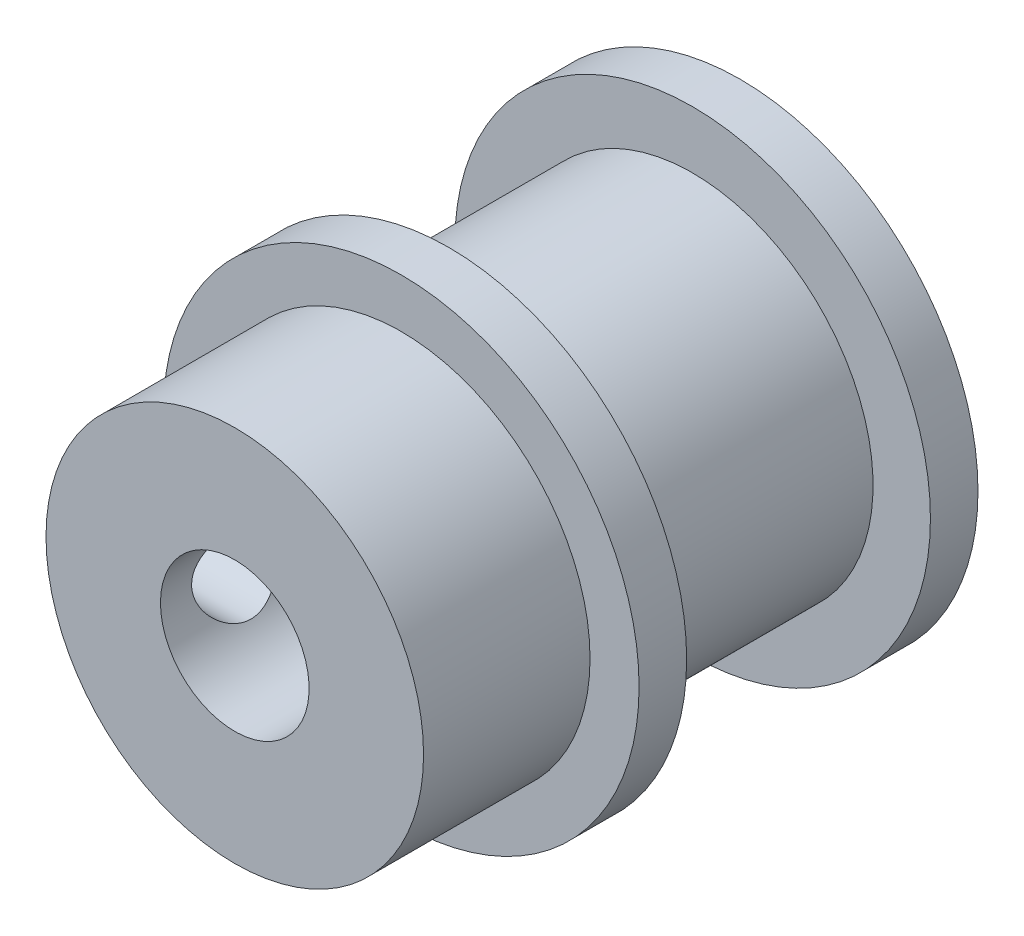
ISO-10303-21;
HEADER;
FILE_DESCRIPTION(('STEP AP214'),'2;1');
FILE_NAME('part.step','',(''),(''),'','','');
FILE_SCHEMA(('AUTOMOTIVE_DESIGN { 1 0 10303 214 1 1 1 1 }'));
ENDSEC;
DATA;
#1=APPLICATION_CONTEXT('core data for automotive mechanical design processes');
#2=APPLICATION_PROTOCOL_DEFINITION('international standard','automotive_design',2000,#1);
#3=PRODUCT_CONTEXT('',#1,'mechanical');
#4=PRODUCT('Part','Part','',(#3));
#5=PRODUCT_RELATED_PRODUCT_CATEGORY('part','',(#4));
#6=PRODUCT_DEFINITION_FORMATION('','',#4);
#7=PRODUCT_DEFINITION_CONTEXT('part definition',#1,'design');
#8=PRODUCT_DEFINITION('design','',#6,#7);
#9=PRODUCT_DEFINITION_SHAPE('','',#8);
#10=(LENGTH_UNIT() NAMED_UNIT(*) SI_UNIT(.MILLI.,.METRE.));
#11=(NAMED_UNIT(*) PLANE_ANGLE_UNIT() SI_UNIT($,.RADIAN.));
#12=(NAMED_UNIT(*) SI_UNIT($,.STERADIAN.) SOLID_ANGLE_UNIT());
#13=UNCERTAINTY_MEASURE_WITH_UNIT(LENGTH_MEASURE(1.E-05),#10,'distance_accuracy_value','');
#14=(GEOMETRIC_REPRESENTATION_CONTEXT(3) GLOBAL_UNCERTAINTY_ASSIGNED_CONTEXT((#13)) GLOBAL_UNIT_ASSIGNED_CONTEXT((#10,
#11,#12)) REPRESENTATION_CONTEXT('',''));
#15=CARTESIAN_POINT('',(0.,0.,0.));
#16=DIRECTION('',(0.,0.,1.));
#17=DIRECTION('',(1.,0.,0.));
#18=AXIS2_PLACEMENT_3D('',#15,#16,#17);
#19=CARTESIAN_POINT('',(0.,0.,0.));
#20=DIRECTION('',(0.,0.,1.));
#21=DIRECTION('',(1.,0.,0.));
#22=AXIS2_PLACEMENT_3D('',#19,#20,#21);
#23=CYLINDRICAL_SURFACE('',#22,8.);
#24=CARTESIAN_POINT('',(0.,0.,0.));
#25=DIRECTION('',(0.,0.,1.));
#26=DIRECTION('',(-1.,0.,0.));
#27=AXIS2_PLACEMENT_3D('',#24,#25,#26);
#28=CIRCLE('',#27,8.);
#29=CARTESIAN_POINT('',(-8.,0.,0.));
#30=VERTEX_POINT('',#29);
#31=EDGE_CURVE('E36',#30,#30,#28,.T.);
#32=ORIENTED_EDGE('',*,*,#31,.T.);
#33=EDGE_LOOP('',(#32));
#34=FACE_BOUND('',#33,.T.);
#35=CARTESIAN_POINT('',(0.,0.,1.6));
#36=DIRECTION('',(0.,0.,1.));
#37=DIRECTION('',(-1.,0.,0.));
#38=AXIS2_PLACEMENT_3D('',#35,#36,#37);
#39=CIRCLE('',#38,8.);
#40=CARTESIAN_POINT('',(-8.,0.,1.6));
#41=VERTEX_POINT('',#40);
#42=EDGE_CURVE('E40',#41,#41,#39,.T.);
#43=ORIENTED_EDGE('',*,*,#42,.F.);
#44=EDGE_LOOP('',(#43));
#45=FACE_BOUND('',#44,.T.);
#46=ADVANCED_FACE('F30',(#34,#45),#23,.T.);
#47=CARTESIAN_POINT('',(0.,0.,0.));
#48=DIRECTION('',(0.,0.,-1.));
#49=DIRECTION('',(-1.,0.,0.));
#50=AXIS2_PLACEMENT_3D('',#47,#48,#49);
#51=PLANE('',#50);
#52=CARTESIAN_POINT('',(0.,0.,0.));
#53=DIRECTION('',(0.,0.,-1.));
#54=DIRECTION('',(-1.,0.,0.));
#55=AXIS2_PLACEMENT_3D('',#52,#53,#54);
#56=CIRCLE('',#55,2.49999999999999);
#57=CARTESIAN_POINT('',(-2.49999999999999,0.,0.));
#58=VERTEX_POINT('',#57);
#59=EDGE_CURVE('E64',#58,#58,#56,.T.);
#60=ORIENTED_EDGE('',*,*,#59,.F.);
#61=EDGE_LOOP('',(#60));
#62=FACE_BOUND('',#61,.T.);
#63=ORIENTED_EDGE('',*,*,#31,.F.);
#64=EDGE_LOOP('',(#63));
#65=FACE_BOUND('',#64,.T.);
#66=ADVANCED_FACE('F102',(#62,#65),#51,.T.);
#67=CARTESIAN_POINT('',(0.,0.,1.6));
#68=DIRECTION('',(0.,0.,-1.));
#69=DIRECTION('',(-1.,0.,0.));
#70=AXIS2_PLACEMENT_3D('',#67,#68,#69);
#71=PLANE('',#70);
#72=CARTESIAN_POINT('',(0.,0.,1.6));
#73=DIRECTION('',(0.,0.,-1.));
#74=DIRECTION('',(-1.,0.,0.));
#75=AXIS2_PLACEMENT_3D('',#72,#73,#74);
#76=CIRCLE('',#75,6.07);
#77=CARTESIAN_POINT('',(-6.07,0.,1.6));
#78=VERTEX_POINT('',#77);
#79=EDGE_CURVE('E45',#78,#78,#76,.F.);
#80=ORIENTED_EDGE('',*,*,#79,.F.);
#81=EDGE_LOOP('',(#80));
#82=FACE_BOUND('',#81,.T.);
#83=ORIENTED_EDGE('',*,*,#42,.T.);
#84=EDGE_LOOP('',(#83));
#85=FACE_BOUND('',#84,.T.);
#86=ADVANCED_FACE('F106',(#82,#85),#71,.F.);
#87=CARTESIAN_POINT('',(0.,0.,-15.5685526472094));
#88=DIRECTION('',(0.,0.,1.));
#89=DIRECTION('',(1.,0.,0.));
#90=AXIS2_PLACEMENT_3D('',#87,#88,#89);
#91=CYLINDRICAL_SURFACE('',#90,6.07);
#92=CARTESIAN_POINT('',(0.,0.,9.8));
#93=DIRECTION('',(0.,0.,1.));
#94=DIRECTION('',(-1.,0.,0.));
#95=AXIS2_PLACEMENT_3D('',#92,#93,#94);
#96=CIRCLE('',#95,6.07);
#97=CARTESIAN_POINT('',(-6.07,0.,9.8));
#98=VERTEX_POINT('',#97);
#99=EDGE_CURVE('E49',#98,#98,#96,.T.);
#100=ORIENTED_EDGE('',*,*,#99,.F.);
#101=EDGE_LOOP('',(#100));
#102=FACE_BOUND('',#101,.T.);
#103=ORIENTED_EDGE('',*,*,#79,.T.);
#104=EDGE_LOOP('',(#103));
#105=FACE_BOUND('',#104,.T.);
#106=ADVANCED_FACE('F113',(#102,#105),#91,.T.);
#107=CARTESIAN_POINT('',(0.,0.,11.4));
#108=DIRECTION('',(0.,0.,-1.));
#109=DIRECTION('',(-1.,0.,0.));
#110=AXIS2_PLACEMENT_3D('',#107,#108,#109);
#111=CYLINDRICAL_SURFACE('',#110,8.);
#112=CARTESIAN_POINT('',(0.,0.,11.4));
#113=DIRECTION('',(0.,0.,-1.));
#114=DIRECTION('',(1.,0.,0.));
#115=AXIS2_PLACEMENT_3D('',#112,#113,#114);
#116=CIRCLE('',#115,8.);
#117=CARTESIAN_POINT('',(-8.,0.,11.4));
#118=VERTEX_POINT('',#117);
#119=EDGE_CURVE('E52',#118,#118,#116,.T.);
#120=CARTESIAN_POINT('',(0.,0.,9.8));
#121=DIRECTION('',(0.,0.,-1.));
#122=DIRECTION('',(1.,0.,0.));
#123=AXIS2_PLACEMENT_3D('',#120,#121,#122);
#124=CIRCLE('',#123,8.);
#125=CARTESIAN_POINT('',(-8.,0.,9.8));
#126=VERTEX_POINT('',#125);
#127=EDGE_CURVE('E53',#126,#126,#124,.T.);
#128=CARTESIAN_POINT('',(-8.,0.,11.4));
#129=CARTESIAN_POINT('',(-8.,0.,11.3833333333333));
#130=CARTESIAN_POINT('',(-8.,0.,11.3666666666667));
#131=CARTESIAN_POINT('',(-8.,0.,11.3333333333333));
#132=CARTESIAN_POINT('',(-8.,0.,11.3166666666667));
#133=CARTESIAN_POINT('',(-8.,0.,11.2833333333333));
#134=CARTESIAN_POINT('',(-8.,0.,11.2666666666667));
#135=CARTESIAN_POINT('',(-8.,0.,11.2333333333333));
#136=CARTESIAN_POINT('',(-8.,0.,11.2166666666667));
#137=CARTESIAN_POINT('',(-8.,0.,11.1833333333333));
#138=CARTESIAN_POINT('',(-8.,0.,11.1666666666667));
#139=CARTESIAN_POINT('',(-8.,0.,11.1333333333333));
#140=CARTESIAN_POINT('',(-8.,0.,11.1166666666667));
#141=CARTESIAN_POINT('',(-8.,0.,11.0833333333333));
#142=CARTESIAN_POINT('',(-8.,0.,11.0666666666667));
#143=CARTESIAN_POINT('',(-8.,0.,11.0333333333333));
#144=CARTESIAN_POINT('',(-8.,0.,11.0166666666667));
#145=CARTESIAN_POINT('',(-8.,0.,10.9833333333333));
#146=CARTESIAN_POINT('',(-8.,0.,10.9666666666667));
#147=CARTESIAN_POINT('',(-8.,0.,10.9333333333333));
#148=CARTESIAN_POINT('',(-8.,0.,10.9166666666667));
#149=CARTESIAN_POINT('',(-8.,0.,10.8833333333333));
#150=CARTESIAN_POINT('',(-8.,0.,10.8666666666667));
#151=CARTESIAN_POINT('',(-8.,0.,10.8333333333333));
#152=CARTESIAN_POINT('',(-8.,0.,10.8166666666667));
#153=CARTESIAN_POINT('',(-8.,0.,10.7833333333333));
#154=CARTESIAN_POINT('',(-8.,0.,10.7666666666667));
#155=CARTESIAN_POINT('',(-8.,0.,10.7333333333333));
#156=CARTESIAN_POINT('',(-8.,0.,10.7166666666667));
#157=CARTESIAN_POINT('',(-8.,0.,10.6833333333333));
#158=CARTESIAN_POINT('',(-8.,0.,10.6666666666667));
#159=CARTESIAN_POINT('',(-8.,0.,10.6333333333333));
#160=CARTESIAN_POINT('',(-8.,0.,10.6166666666667));
#161=CARTESIAN_POINT('',(-8.,0.,10.5833333333333));
#162=CARTESIAN_POINT('',(-8.,0.,10.5666666666667));
#163=CARTESIAN_POINT('',(-8.,0.,10.5333333333333));
#164=CARTESIAN_POINT('',(-8.,0.,10.5166666666667));
#165=CARTESIAN_POINT('',(-8.,0.,10.4833333333333));
#166=CARTESIAN_POINT('',(-8.,0.,10.4666666666667));
#167=CARTESIAN_POINT('',(-8.,0.,10.4333333333333));
#168=CARTESIAN_POINT('',(-8.,0.,10.4166666666667));
#169=CARTESIAN_POINT('',(-8.,0.,10.3833333333333));
#170=CARTESIAN_POINT('',(-8.,0.,10.3666666666667));
#171=CARTESIAN_POINT('',(-8.,0.,10.3333333333333));
#172=CARTESIAN_POINT('',(-8.,0.,10.3166666666667));
#173=CARTESIAN_POINT('',(-8.,0.,10.2833333333333));
#174=CARTESIAN_POINT('',(-8.,0.,10.2666666666667));
#175=CARTESIAN_POINT('',(-8.,0.,10.2333333333333));
#176=CARTESIAN_POINT('',(-8.,0.,10.2166666666667));
#177=CARTESIAN_POINT('',(-8.,0.,10.1833333333333));
#178=CARTESIAN_POINT('',(-8.,0.,10.1666666666667));
#179=CARTESIAN_POINT('',(-8.,0.,10.1333333333333));
#180=CARTESIAN_POINT('',(-8.,0.,10.1166666666667));
#181=CARTESIAN_POINT('',(-8.,0.,10.0833333333333));
#182=CARTESIAN_POINT('',(-8.,0.,10.0666666666667));
#183=CARTESIAN_POINT('',(-8.,0.,10.0333333333333));
#184=CARTESIAN_POINT('',(-8.,0.,10.0166666666667));
#185=CARTESIAN_POINT('',(-8.,0.,9.98333333333333));
#186=CARTESIAN_POINT('',(-8.,0.,9.96666666666667));
#187=CARTESIAN_POINT('',(-8.,0.,9.93333333333333));
#188=CARTESIAN_POINT('',(-8.,0.,9.91666666666667));
#189=CARTESIAN_POINT('',(-8.,0.,9.88333333333333));
#190=CARTESIAN_POINT('',(-8.,0.,9.86666666666667));
#191=CARTESIAN_POINT('',(-8.,0.,9.83333333333333));
#192=CARTESIAN_POINT('',(-8.,0.,9.81666666666667));
#193=CARTESIAN_POINT('',(-8.,0.,9.8));
#194=B_SPLINE_CURVE_WITH_KNOTS('',3,(#128,#129,#130,#131,#132,#133,#134,#135,#136,#137,#138,
#139,#140,#141,#142,#143,#144,#145,#146,#147,#148,#149,#150,#151,#152,#153,#154,#155,#156,#157,
#158,#159,#160,#161,#162,#163,#164,#165,#166,#167,#168,#169,#170,#171,#172,#173,#174,#175,#176,
#177,#178,#179,#180,#181,#182,#183,#184,#185,#186,#187,#188,#189,#190,#191,#192,#193),
.UNSPECIFIED.,.F.,.F.,(4,2,2,2,2,2,2,2,2,2,2,2,2,2,2,2,2,2,2,2,2,2,2,2,2,2,2,2,2,2,2,2,4),(0.,
0.0499999999999997,0.0999999999999994,0.149999999999999,0.199999999999999,0.249999999999999,
0.299999999999998,0.35,0.399999999999999,0.449999999999999,0.499999999999999,0.549999999999998,
0.599999999999998,0.649999999999998,0.699999999999999,0.749999999999999,0.799999999999999,
0.849999999999998,0.899999999999998,0.949999999999998,0.999999999999999,1.05,1.1,1.15,1.2,1.25,
1.3,1.35,1.4,1.45,1.5,1.55,1.6),.UNSPECIFIED.);
#195=EDGE_CURVE('BSEAM118',#118,#126,#194,.T.);
#196=ORIENTED_EDGE('',*,*,#119,.T.);
#197=ORIENTED_EDGE('',*,*,#127,.F.);
#198=ORIENTED_EDGE('',*,*,#195,.T.);
#199=ORIENTED_EDGE('',*,*,#195,.F.);
#200=EDGE_LOOP('',(#196,#198,#197,#199));
#201=FACE_BOUND('',#200,.T.);
#202=ADVANCED_FACE('F118',(#201),#111,.T.);
#203=CARTESIAN_POINT('',(0.,0.,11.4));
#204=DIRECTION('',(0.,0.,1.));
#205=DIRECTION('',(1.,0.,0.));
#206=AXIS2_PLACEMENT_3D('',#203,#204,#205);
#207=PLANE('',#206);
#208=CARTESIAN_POINT('',(0.,0.,11.4));
#209=DIRECTION('',(0.,0.,1.));
#210=DIRECTION('',(1.,0.,0.));
#211=AXIS2_PLACEMENT_3D('',#208,#209,#210);
#212=CIRCLE('',#211,6.35);
#213=CARTESIAN_POINT('',(6.35,0.,11.4));
#214=VERTEX_POINT('',#213);
#215=EDGE_CURVE('E10',#214,#214,#212,.T.);
#216=ORIENTED_EDGE('',*,*,#215,.F.);
#217=EDGE_LOOP('',(#216));
#218=FACE_BOUND('',#217,.T.);
#219=ORIENTED_EDGE('',*,*,#119,.F.);
#220=EDGE_LOOP('',(#219));
#221=FACE_BOUND('',#220,.T.);
#222=ADVANCED_FACE('F125',(#218,#221),#207,.T.);
#223=CARTESIAN_POINT('',(0.,0.,9.8));
#224=DIRECTION('',(0.,0.,1.));
#225=DIRECTION('',(1.,0.,0.));
#226=AXIS2_PLACEMENT_3D('',#223,#224,#225);
#227=PLANE('',#226);
#228=ORIENTED_EDGE('',*,*,#99,.T.);
#229=EDGE_LOOP('',(#228));
#230=FACE_BOUND('',#229,.T.);
#231=ORIENTED_EDGE('',*,*,#127,.T.);
#232=EDGE_LOOP('',(#231));
#233=FACE_BOUND('',#232,.T.);
#234=ADVANCED_FACE('F98',(#230,#233),#227,.F.);
#235=CARTESIAN_POINT('',(0.,0.,-6.56051224213831));
#236=DIRECTION('',(0.,0.,1.));
#237=DIRECTION('',(1.,0.,0.));
#238=AXIS2_PLACEMENT_3D('',#235,#236,#237);
#239=CYLINDRICAL_SURFACE('',#238,6.35);
#240=CARTESIAN_POINT('',(-6.35,0.,15.9528365135193));
#241=CARTESIAN_POINT('',(-6.34999851724395,0.0830209487421049,15.9528339366377));
#242=CARTESIAN_POINT('',(-6.34835548464635,0.166071705542504,15.9459208040846));
#243=CARTESIAN_POINT('',(-6.34196006203195,0.329802616773766,15.9184865242906));
#244=CARTESIAN_POINT('',(-6.33720570059271,0.410481234262163,15.8979567490638));
#245=CARTESIAN_POINT('',(-6.32511541536286,0.567078972002022,15.8439772061771));
#246=CARTESIAN_POINT('',(-6.31778241043488,0.64300335974414,15.8105420424467));
#247=CARTESIAN_POINT('',(-6.3013205537597,0.788164128517249,15.7317499598303));
#248=CARTESIAN_POINT('',(-6.29219168938457,0.857400462514774,15.6863929571128));
#249=CARTESIAN_POINT('',(-6.27294410619427,0.988504146075392,15.5841559740953));
#250=CARTESIAN_POINT('',(-6.26281145281055,1.05022983067825,15.5270969405367));
#251=CARTESIAN_POINT('',(-6.24279339171246,1.16333007962071,15.4034594223295));
#252=CARTESIAN_POINT('',(-6.23290800919793,1.2147035926849,15.3368799720437));
#253=CARTESIAN_POINT('',(-6.21436474587978,1.30628857858909,15.1950155590712));
#254=CARTESIAN_POINT('',(-6.20572463411779,1.34634507695963,15.1196280157515));
#255=CARTESIAN_POINT('',(-6.19085199880808,1.41316353749857,14.9629529123057));
#256=CARTESIAN_POINT('',(-6.18461913528442,1.43992737714354,14.8816661872495));
#257=CARTESIAN_POINT('',(-6.1754093638889,1.4789243640839,14.7170486009501));
#258=CARTESIAN_POINT('',(-6.17237584620284,1.4914104910839,14.6337809072313));
#259=CARTESIAN_POINT('',(-6.16973853210434,1.50228500188724,14.4662816667529));
#260=CARTESIAN_POINT('',(-6.17013424074105,1.5006754201675,14.3820502608416));
#261=CARTESIAN_POINT('',(-6.17425961423211,1.48360683567082,14.2169265525034));
#262=CARTESIAN_POINT('',(-6.17791755158493,1.4684457767716,14.1360013840218));
#263=CARTESIAN_POINT('',(-6.18804133190497,1.42517840490093,13.9778767861164));
#264=CARTESIAN_POINT('',(-6.19450735566558,1.39707125841274,13.9006775969386));
#265=CARTESIAN_POINT('',(-6.20958678218059,1.32844678458484,13.7513798697232));
#266=CARTESIAN_POINT('',(-6.21821926579501,1.28781841151537,13.6793343815247));
#267=CARTESIAN_POINT('',(-6.23664776102026,1.19538261640077,13.5429751507037));
#268=CARTESIAN_POINT('',(-6.24644395581355,1.14357343330741,13.4786626285598));
#269=CARTESIAN_POINT('',(-6.26640074159939,1.02868790517089,13.3578837785624));
#270=CARTESIAN_POINT('',(-6.27656427474606,0.965359229076418,13.3016576832906));
#271=CARTESIAN_POINT('',(-6.29588562944104,0.830052536460324,13.2005810109286));
#272=CARTESIAN_POINT('',(-6.30504342639666,0.758074308526314,13.155730711969));
#273=CARTESIAN_POINT('',(-6.32135942493142,0.607191614109492,13.0786038851033));
#274=CARTESIAN_POINT('',(-6.32851195395597,0.528268312455402,13.0463629272039));
#275=CARTESIAN_POINT('',(-6.33996993682454,0.365916560598579,12.9956702108494));
#276=CARTESIAN_POINT('',(-6.34427587535181,0.282488879965401,12.9772161048651));
#277=CARTESIAN_POINT('',(-6.34948503249582,0.115553538980352,12.9549798275075));
#278=CARTESIAN_POINT('',(-6.35046421324579,0.0320918238016502,12.9508700612716));
#279=CARTESIAN_POINT('',(-6.34912429021221,-0.134326079532355,12.9565454456191));
#280=CARTESIAN_POINT('',(-6.34680544961474,-0.217282307495616,12.9663294874597));
#281=CARTESIAN_POINT('',(-6.33917838174839,-0.37922016985958,12.9992438951182));
#282=CARTESIAN_POINT('',(-6.33390950352625,-0.458239510996913,13.0221986809419));
#283=CARTESIAN_POINT('',(-6.32097400029951,-0.611304086387359,13.0806050138535));
#284=CARTESIAN_POINT('',(-6.31330714919518,-0.685348850798215,13.1160577393855));
#285=CARTESIAN_POINT('',(-6.29624149651372,-0.827689304318969,13.1991100651196));
#286=CARTESIAN_POINT('',(-6.28681663475878,-0.895872345524981,13.2468972492251));
#287=CARTESIAN_POINT('',(-6.26732668110161,-1.02336854827638,13.3530189840094));
#288=CARTESIAN_POINT('',(-6.25726149136242,-1.08268034970591,13.4113551490085));
#289=CARTESIAN_POINT('',(-6.23735679650375,-1.19207580420076,13.5384324966406));
#290=CARTESIAN_POINT('',(-6.22752694929493,-1.24193090389247,13.6073722471142));
#291=CARTESIAN_POINT('',(-6.20945265145426,-1.32936029211664,13.7528359354712));
#292=CARTESIAN_POINT('',(-6.2012081299286,-1.36693512985993,13.8293595339822));
#293=CARTESIAN_POINT('',(-6.18732408481131,-1.42846636533289,13.9874008455852));
#294=CARTESIAN_POINT('',(-6.18166930794986,-1.45250270111901,14.068886027581));
#295=CARTESIAN_POINT('',(-6.17358371023307,-1.48649761919311,14.234892392102));
#296=CARTESIAN_POINT('',(-6.17115227288946,-1.49645889346788,14.3194129909035));
#297=CARTESIAN_POINT('',(-6.16983199335337,-1.50189189090822,14.4867753920578));
#298=CARTESIAN_POINT('',(-6.17085418392761,-1.49772748776162,14.5696048805866));
#299=CARTESIAN_POINT('',(-6.17612233302335,-1.47585131759939,14.7333452390736));
#300=CARTESIAN_POINT('',(-6.18036823966433,-1.45813976860322,14.8142561398869));
#301=CARTESIAN_POINT('',(-6.19155859321837,-1.40986066978044,14.9715155299881));
#302=CARTESIAN_POINT('',(-6.198490161484,-1.37935441810503,15.0478838163832));
#303=CARTESIAN_POINT('',(-6.21427398682872,-1.30640175172683,15.1944693506775));
#304=CARTESIAN_POINT('',(-6.22312648105611,-1.26395386257482,15.2646858376014));
#305=CARTESIAN_POINT('',(-6.24201391004488,-1.16715206254848,15.3987493003044));
#306=CARTESIAN_POINT('',(-6.25207168946107,-1.11254249880654,15.4624084947976));
#307=CARTESIAN_POINT('',(-6.27209257501468,-0.993474944889205,15.5797781706955));
#308=CARTESIAN_POINT('',(-6.28205565844781,-0.929014653170159,15.6334863206135));
#309=CARTESIAN_POINT('',(-6.30095070373692,-0.790855077532081,15.7302448497052));
#310=CARTESIAN_POINT('',(-6.30986403352165,-0.717026696497846,15.7731147766827));
#311=CARTESIAN_POINT('',(-6.32546353967866,-0.563011253816946,15.8457672103146));
#312=CARTESIAN_POINT('',(-6.33215143699731,-0.482829165239743,15.8755598354773));
#313=CARTESIAN_POINT('',(-6.34146337323501,-0.335568702357189,15.9163801483638));
#314=CARTESIAN_POINT('',(-6.3446436242047,-0.269238102345869,15.9300233605788));
#315=CARTESIAN_POINT('',(-6.34891247920239,-0.135278213529583,15.9482523224271));
#316=CARTESIAN_POINT('',(-6.35000120821274,-0.0676490025691895,15.9528386132721));
#317=CARTESIAN_POINT('',(-6.35,0.,15.9528365135193));
#318=B_SPLINE_CURVE_WITH_KNOTS('',3,(#240,#241,#242,#243,#244,#245,#246,#247,#248,#249,#250,
#251,#252,#253,#254,#255,#256,#257,#258,#259,#260,#261,#262,#263,#264,#265,#266,#267,#268,#269,
#270,#271,#272,#273,#274,#275,#276,#277,#278,#279,#280,#281,#282,#283,#284,#285,#286,#287,#288,
#289,#290,#291,#292,#293,#294,#295,#296,#297,#298,#299,#300,#301,#302,#303,#304,#305,#306,#307,
#308,#309,#310,#311,#312,#313,#314,#315,#316,#317),.UNSPECIFIED.,.T.,.F.,(4,2,2,2,2,2,2,2,2,2,2,
2,2,2,2,2,2,2,2,2,2,2,2,2,2,2,2,2,2,2,2,2,2,2,2,2,2,2,4),(0.,0.248815070913741,
0.497787950658722,0.746479911109805,0.995173620349715,1.24800235932538,1.50085676043725,
1.757022250971,2.01315154998106,2.26466865776916,2.51614946391931,2.76223359968084,
3.00833358145961,3.25668218758357,3.50506993876881,3.75975438391659,4.01444505532945,
4.26984909538286,4.52520963709544,4.7746986858651,5.02416782622494,5.27038608564856,
5.51662756746634,5.76686059612934,6.01713195064175,6.27284210654467,6.52854082474262,
6.78271350366642,7.03683756311166,7.28446569177382,7.53208983534428,7.77854094830847,
8.02502250427127,8.27727905299747,8.52959462980916,8.78586924469394,9.04194521710609,
9.24470244341193,9.44744755324901),.UNSPECIFIED.);
#319=CARTESIAN_POINT('',(-6.35,0.,15.9528365135193));
#320=VERTEX_POINT('',#319);
#321=EDGE_CURVE('E67',#320,#320,#318,.T.);
#322=ORIENTED_EDGE('',*,*,#321,.F.);
#323=EDGE_LOOP('',(#322));
#324=FACE_BOUND('',#323,.T.);
#325=ORIENTED_EDGE('',*,*,#215,.T.);
#326=EDGE_LOOP('',(#325));
#327=FACE_BOUND('',#326,.T.);
#328=CARTESIAN_POINT('',(0.,0.,17.));
#329=DIRECTION('',(0.,0.,1.));
#330=DIRECTION('',(-1.,0.,0.));
#331=AXIS2_PLACEMENT_3D('',#328,#329,#330);
#332=CIRCLE('',#331,6.35);
#333=CARTESIAN_POINT('',(-6.35,0.,17.));
#334=VERTEX_POINT('',#333);
#335=EDGE_CURVE('E56',#334,#334,#332,.T.);
#336=ORIENTED_EDGE('',*,*,#335,.F.);
#337=EDGE_LOOP('',(#336));
#338=FACE_BOUND('',#337,.T.);
#339=ADVANCED_FACE('F78',(#324,#327,#338),#239,.T.);
#340=CARTESIAN_POINT('',(0.,0.,17.));
#341=DIRECTION('',(0.,0.,-1.));
#342=DIRECTION('',(-1.,0.,0.));
#343=AXIS2_PLACEMENT_3D('',#340,#341,#342);
#344=PLANE('',#343);
#345=CARTESIAN_POINT('',(0.,0.,17.));
#346=DIRECTION('',(0.,0.,-1.));
#347=DIRECTION('',(-1.,0.,0.));
#348=AXIS2_PLACEMENT_3D('',#345,#346,#347);
#349=CIRCLE('',#348,2.49999999999999);
#350=CARTESIAN_POINT('',(-2.49999999999999,0.,17.));
#351=VERTEX_POINT('',#350);
#352=EDGE_CURVE('E61',#351,#351,#349,.T.);
#353=ORIENTED_EDGE('',*,*,#352,.T.);
#354=EDGE_LOOP('',(#353));
#355=FACE_BOUND('',#354,.T.);
#356=ORIENTED_EDGE('',*,*,#335,.T.);
#357=EDGE_LOOP('',(#356));
#358=FACE_BOUND('',#357,.T.);
#359=ADVANCED_FACE('F91',(#355,#358),#344,.F.);
#360=CARTESIAN_POINT('',(0.,0.,0.));
#361=DIRECTION('',(0.,0.,-1.));
#362=DIRECTION('',(-1.,0.,0.));
#363=AXIS2_PLACEMENT_3D('',#360,#361,#362);
#364=CYLINDRICAL_SURFACE('',#363,2.49999999999999);
#365=CARTESIAN_POINT('',(-2.49999999999999,0.,15.9528365135193));
#366=CARTESIAN_POINT('',(-2.49999625789731,0.0767298334620154,15.9528324225094));
#367=CARTESIAN_POINT('',(-2.49642904615008,0.153582320644177,15.946907842593));
#368=CARTESIAN_POINT('',(-2.48249903608566,0.304975509530677,15.923512194004));
#369=CARTESIAN_POINT('',(-2.47211948032717,0.379510034596045,15.9060126516651));
#370=CARTESIAN_POINT('',(-2.44561558054487,0.523751827790834,15.8604501523524));
#371=CARTESIAN_POINT('',(-2.42951973272942,0.593481028226563,15.8324395553561));
#372=CARTESIAN_POINT('',(-2.39295367626406,0.727030318214655,15.7669761803783));
#373=CARTESIAN_POINT('',(-2.37248455380254,0.790851869416379,15.7295257465505));
#374=CARTESIAN_POINT('',(-2.32705360719086,0.91629927899931,15.6430616868107));
#375=CARTESIAN_POINT('',(-2.30186792195984,0.97738402008141,15.5933828181679));
#376=CARTESIAN_POINT('',(-2.25030439279632,1.0908827041189,15.485369309691));
#377=CARTESIAN_POINT('',(-2.22392505153569,1.14328534948112,15.427023576332));
#378=CARTESIAN_POINT('',(-2.16911066995909,1.24444996762973,15.2949130030226));
#379=CARTESIAN_POINT('',(-2.14082017703648,1.29197766378808,15.220134742538));
#380=CARTESIAN_POINT('',(-2.08938301412123,1.37361437764896,15.0619899402762));
#381=CARTESIAN_POINT('',(-2.06622802273936,1.40774517335159,14.9786376172717));
#382=CARTESIAN_POINT('',(-2.03354629660929,1.45440601714221,14.8262400628661));
#383=CARTESIAN_POINT('',(-2.0220788313759,1.47016197246826,14.758600514909));
#384=CARTESIAN_POINT('',(-2.00590308295502,1.49216172340474,14.6210327976889));
#385=CARTESIAN_POINT('',(-2.00118639643758,1.49841734556835,14.5511075847648));
#386=CARTESIAN_POINT('',(-1.99920922463855,1.50105508796008,14.410825019302));
#387=CARTESIAN_POINT('',(-2.00196337012717,1.49741783408418,14.3404670884261));
#388=CARTESIAN_POINT('',(-2.0145326144374,1.48046060478827,14.2015577380917));
#389=CARTESIAN_POINT('',(-2.02435302432225,1.46713334620102,14.1330077176719));
#390=CARTESIAN_POINT('',(-2.04953186944257,1.43173921881792,14.0003062713912));
#391=CARTESIAN_POINT('',(-2.06481711652536,1.40978748666086,13.9361094595948));
#392=CARTESIAN_POINT('',(-2.09927051350827,1.35795061770836,13.8121415225912));
#393=CARTESIAN_POINT('',(-2.11844008623464,1.32806257259704,13.7523720300954));
#394=CARTESIAN_POINT('',(-2.16255327268984,1.25517983184582,13.6278524163965));
#395=CARTESIAN_POINT('',(-2.18792043372991,1.21080724397722,13.5640584205644));
#396=CARTESIAN_POINT('',(-2.2393059976438,1.11291092784003,13.4441600298523));
#397=CARTESIAN_POINT('',(-2.26532500262148,1.05937845100578,13.3880630795428));
#398=CARTESIAN_POINT('',(-2.31935504958315,0.935811834382963,13.2772235316976));
#399=CARTESIAN_POINT('',(-2.34713836268531,0.864517682704955,13.2237592075033));
#400=CARTESIAN_POINT('',(-2.39772428433979,0.712276050458999,13.1297144663214));
#401=CARTESIAN_POINT('',(-2.42052955425514,0.631333763943563,13.0891271597294));
#402=CARTESIAN_POINT('',(-2.4573039206615,0.467197585268206,13.0249043307234));
#403=CARTESIAN_POINT('',(-2.47173957439702,0.384467624173581,13.0003611578034));
#404=CARTESIAN_POINT('',(-2.49218842813549,0.215047895144641,12.9658253161139));
#405=CARTESIAN_POINT('',(-2.49821172952736,0.128363005661321,12.9558151957657));
#406=CARTESIAN_POINT('',(-2.50090570374609,-0.0337146143773941,12.951328665841));
#407=CARTESIAN_POINT('',(-2.49873521714284,-0.109042473418715,12.9549276584341));
#408=CARTESIAN_POINT('',(-2.48778712087047,-0.257829401986057,12.9732623665912));
#409=CARTESIAN_POINT('',(-2.47900964518036,-0.331288509376102,12.9879978563251));
#410=CARTESIAN_POINT('',(-2.45594792442189,-0.472574932157609,13.0273799463318));
#411=CARTESIAN_POINT('',(-2.44180275662554,-0.54049575092848,13.0517768625928));
#412=CARTESIAN_POINT('',(-2.40913880862843,-0.671265749087258,13.1095138898846));
#413=CARTESIAN_POINT('',(-2.3906191658651,-0.734113924963903,13.142855764866));
#414=CARTESIAN_POINT('',(-2.34845496237359,-0.860006262823857,13.221393492728));
#415=CARTESIAN_POINT('',(-2.32447802739879,-0.922394150456831,13.2674603425977));
#416=CARTESIAN_POINT('',(-2.2747426557473,-1.03902603131013,13.3682279070079));
#417=CARTESIAN_POINT('',(-2.24898216586359,-1.09326040273737,13.4229386683718));
#418=CARTESIAN_POINT('',(-2.1944542390989,-1.19931996735578,13.5477469035565));
#419=CARTESIAN_POINT('',(-2.1657324174629,-1.24991019630914,13.6189203989848));
#420=CARTESIAN_POINT('',(-2.11216182066709,-1.33845238915667,13.7700525380875));
#421=CARTESIAN_POINT('',(-2.08730897997689,-1.3764176676978,13.8500018074121));
#422=CARTESIAN_POINT('',(-2.04984909240518,-1.43142578795776,13.999079535826));
#423=CARTESIAN_POINT('',(-2.03575659328728,-1.45121625336189,14.0668168258779));
#424=CARTESIAN_POINT('',(-2.01409605743543,-1.48113663905971,14.2053685915994));
#425=CARTESIAN_POINT('',(-2.0065189764272,-1.4912799529763,14.2761786578471));
#426=CARTESIAN_POINT('',(-1.99900446616266,-1.5013413041663,14.4192134611163));
#427=CARTESIAN_POINT('',(-1.99909576445936,-1.50122089107868,14.4914425042063));
#428=CARTESIAN_POINT('',(-2.00697717892849,-1.49066472959327,14.6347309491288));
#429=CARTESIAN_POINT('',(-2.01477148138819,-1.48022337215758,14.7057896935999));
#430=CARTESIAN_POINT('',(-2.03633185242979,-1.45040174148912,14.8413249310915));
#431=CARTESIAN_POINT('',(-2.04979211805579,-1.43147636845351,14.9059536078262));
#432=CARTESIAN_POINT('',(-2.0810550196015,-1.38563242076993,15.0311737679935));
#433=CARTESIAN_POINT('',(-2.09885929040481,-1.35871083588479,15.0917637204798));
#434=CARTESIAN_POINT('',(-2.14012990550915,-1.29289245555732,15.2171563707401));
#435=CARTESIAN_POINT('',(-2.16404587582638,-1.25279167675753,15.2811776173736));
#436=CARTESIAN_POINT('',(-2.21320127030766,-1.16375698389084,15.4022165861366));
#437=CARTESIAN_POINT('',(-2.2384417720502,-1.11481579607798,15.4592284756718));
#438=CARTESIAN_POINT('',(-2.29225690291475,-1.00009777425734,15.574187462651));
#439=CARTESIAN_POINT('',(-2.32070308663656,-0.932876819313904,15.6307675884155));
#440=CARTESIAN_POINT('',(-2.37365428872366,-0.78846243444559,15.7319343693826));
#441=CARTESIAN_POINT('',(-2.39815789310934,-0.711265444501542,15.7765167255041));
#442=CARTESIAN_POINT('',(-2.43985578654393,-0.551125230801458,15.850622321093));
#443=CARTESIAN_POINT('',(-2.45725077479785,-0.468430086957218,15.8805645784461));
#444=CARTESIAN_POINT('',(-2.48366273001244,-0.297973306118812,15.9255612087303));
#445=CARTESIAN_POINT('',(-2.49271125871484,-0.210232099648617,15.9406716813763));
#446=CARTESIAN_POINT('',(-2.49802001168185,-0.10155809691754,15.949533968228));
#447=CARTESIAN_POINT('',(-2.4987611465636,-0.0812762590282812,15.9507709308254));
#448=CARTESIAN_POINT('',(-2.49975164517365,-0.0406658206871146,15.9524227598902));
#449=CARTESIAN_POINT('',(-2.50000099184314,-0.0203372186375705,15.9528375978402));
#450=CARTESIAN_POINT('',(-2.49999999999999,0.,15.9528365135193));
#451=B_SPLINE_CURVE_WITH_KNOTS('',3,(#365,#366,#367,#368,#369,#370,#371,#372,#373,#374,#375,
#376,#377,#378,#379,#380,#381,#382,#383,#384,#385,#386,#387,#388,#389,#390,#391,#392,#393,#394,
#395,#396,#397,#398,#399,#400,#401,#402,#403,#404,#405,#406,#407,#408,#409,#410,#411,#412,#413,
#414,#415,#416,#417,#418,#419,#420,#421,#422,#423,#424,#425,#426,#427,#428,#429,#430,#431,#432,
#433,#434,#435,#436,#437,#438,#439,#440,#441,#442,#443,#444,#445,#446,#447,#448,#449,#450),
.UNSPECIFIED.,.T.,.F.,(4,2,2,2,2,2,2,2,2,2,2,2,2,2,2,2,2,2,2,2,2,2,2,2,2,2,2,2,2,2,2,2,2,2,2,2,
2,2,2,2,2,2,4),(0.,0.230102237548648,0.460772627520009,0.690308884600008,0.919788197992271,
1.16681590732472,1.414162579348,1.69183813189806,1.96906040692091,2.17933829855632,
2.38935420916577,2.59978170870724,2.81036753273871,3.01823267593205,3.22617409809867,
3.47046995225161,3.71500044803672,3.99360957884689,4.27206939275322,4.53296790696557,
4.79355286918233,5.01875602722424,5.24395461863452,5.46367785689769,5.68344445659022,
5.92601365818359,6.16886690081833,6.44336762428006,6.71757792616452,6.93257787314689,
7.14727888733315,7.36278425777429,7.57840681155721,7.78364098331138,7.98895251523031,
8.22578610052281,8.46281544370203,8.73854311775514,9.0143694603198,9.28175654462672,
9.54812832184443,9.60911473335172,9.67010326027636),.UNSPECIFIED.);
#452=CARTESIAN_POINT('',(-2.49999999999999,0.,15.9528365135193));
#453=VERTEX_POINT('',#452);
#454=EDGE_CURVE('E74',#453,#453,#451,.T.);
#455=ORIENTED_EDGE('',*,*,#454,.T.);
#456=EDGE_LOOP('',(#455));
#457=FACE_BOUND('',#456,.T.);
#458=ORIENTED_EDGE('',*,*,#352,.F.);
#459=EDGE_LOOP('',(#458));
#460=FACE_BOUND('',#459,.T.);
#461=ORIENTED_EDGE('',*,*,#59,.T.);
#462=EDGE_LOOP('',(#461));
#463=FACE_BOUND('',#462,.T.);
#464=ADVANCED_FACE('F85',(#457,#460,#463),#364,.F.);
#465=CARTESIAN_POINT('',(-6.35,0.,14.4528365135193));
#466=DIRECTION('',(-1.,0.,0.));
#467=DIRECTION('',(0.,0.,1.));
#468=AXIS2_PLACEMENT_3D('',#465,#466,#467);
#469=CYLINDRICAL_SURFACE('',#468,1.49999999999999);
#470=ORIENTED_EDGE('',*,*,#321,.T.);
#471=EDGE_LOOP('',(#470));
#472=FACE_BOUND('',#471,.T.);
#473=ORIENTED_EDGE('',*,*,#454,.F.);
#474=EDGE_LOOP('',(#473));
#475=FACE_BOUND('',#474,.T.);
#476=ADVANCED_FACE('F82',(#472,#475),#469,.F.);
#477=CLOSED_SHELL('',(#46,#66,#86,#106,#202,#222,#234,#339,#359,#464,#476));
#478=MANIFOLD_SOLID_BREP('B2',#477);
#479=ADVANCED_BREP_SHAPE_REPRESENTATION('',(#18,#478),#14);
#480=SHAPE_DEFINITION_REPRESENTATION(#9,#479);
ENDSEC;
END-ISO-10303-21;
